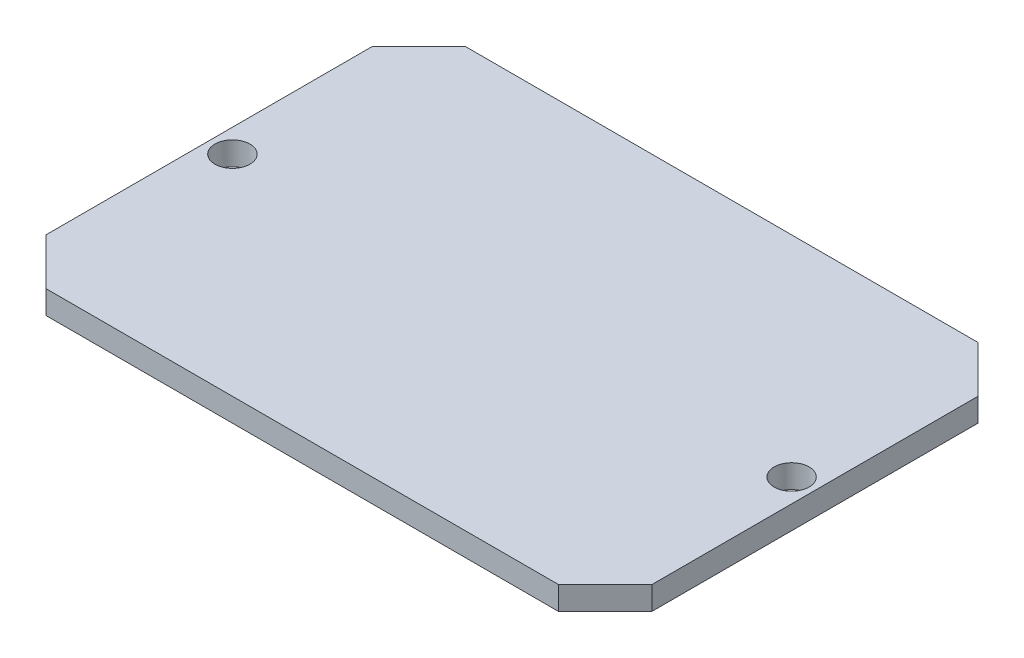
ISO-10303-21;
HEADER;
FILE_DESCRIPTION(('STEP AP214'),'2;1');
FILE_NAME('part.step','',(''),(''),'','','');
FILE_SCHEMA(('AUTOMOTIVE_DESIGN { 1 0 10303 214 1 1 1 1 }'));
ENDSEC;
DATA;
#1=APPLICATION_CONTEXT('core data for automotive mechanical design processes');
#2=APPLICATION_PROTOCOL_DEFINITION('international standard','automotive_design',2000,#1);
#3=PRODUCT_CONTEXT('',#1,'mechanical');
#4=PRODUCT('Part','Part','',(#3));
#5=PRODUCT_RELATED_PRODUCT_CATEGORY('part','',(#4));
#6=PRODUCT_DEFINITION_FORMATION('','',#4);
#7=PRODUCT_DEFINITION_CONTEXT('part definition',#1,'design');
#8=PRODUCT_DEFINITION('design','',#6,#7);
#9=PRODUCT_DEFINITION_SHAPE('','',#8);
#10=(LENGTH_UNIT() NAMED_UNIT(*) SI_UNIT(.MILLI.,.METRE.));
#11=(NAMED_UNIT(*) PLANE_ANGLE_UNIT() SI_UNIT($,.RADIAN.));
#12=(NAMED_UNIT(*) SI_UNIT($,.STERADIAN.) SOLID_ANGLE_UNIT());
#13=UNCERTAINTY_MEASURE_WITH_UNIT(LENGTH_MEASURE(1.E-05),#10,'distance_accuracy_value','');
#14=(GEOMETRIC_REPRESENTATION_CONTEXT(3) GLOBAL_UNCERTAINTY_ASSIGNED_CONTEXT((#13)) GLOBAL_UNIT_ASSIGNED_CONTEXT((#10,
#11,#12)) REPRESENTATION_CONTEXT('',''));
#15=CARTESIAN_POINT('',(0.,0.,0.));
#16=DIRECTION('',(0.,0.,1.));
#17=DIRECTION('',(1.,0.,0.));
#18=AXIS2_PLACEMENT_3D('',#15,#16,#17);
#19=CARTESIAN_POINT('',(31.75,3.175,-19.05));
#20=DIRECTION('',(0.,-1.,0.));
#21=DIRECTION('',(0.,0.,-1.));
#22=AXIS2_PLACEMENT_3D('',#19,#20,#21);
#23=PLANE('',#22);
#24=DIRECTION('',(1.,0.,0.));
#25=VECTOR('',#24,1.);
#26=CARTESIAN_POINT('',(-31.7499999999999,3.175,28.575));
#27=LINE('',#26,#25);
#28=CARTESIAN_POINT('',(-34.925,3.175,28.575));
#29=VERTEX_POINT('',#28);
#30=CARTESIAN_POINT('',(34.925,3.175,28.575));
#31=VERTEX_POINT('',#30);
#32=EDGE_CURVE('E171',#29,#31,#27,.T.);
#33=ORIENTED_EDGE('',*,*,#32,.T.);
#34=DIRECTION('',(-0.707106781186547,0.,0.707106781186548));
#35=VECTOR('',#34,1.);
#36=CARTESIAN_POINT('',(41.275,3.175,22.225));
#37=LINE('',#36,#35);
#38=CARTESIAN_POINT('',(41.275,3.175,22.225));
#39=VERTEX_POINT('',#38);
#40=EDGE_CURVE('E148',#31,#39,#37,.F.);
#41=ORIENTED_EDGE('',*,*,#40,.T.);
#42=DIRECTION('',(0.,0.,-1.));
#43=VECTOR('',#42,1.);
#44=CARTESIAN_POINT('',(41.275,3.175,-19.0499999999999));
#45=LINE('',#44,#43);
#46=CARTESIAN_POINT('',(41.275,3.175,-22.225));
#47=VERTEX_POINT('',#46);
#48=EDGE_CURVE('E119',#39,#47,#45,.T.);
#49=ORIENTED_EDGE('',*,*,#48,.T.);
#50=DIRECTION('',(0.707106781186546,0.,0.70710678118655));
#51=VECTOR('',#50,1.);
#52=CARTESIAN_POINT('',(34.925,3.175,-28.575));
#53=LINE('',#52,#51);
#54=CARTESIAN_POINT('',(34.925,3.175,-28.575));
#55=VERTEX_POINT('',#54);
#56=EDGE_CURVE('E143',#47,#55,#53,.F.);
#57=ORIENTED_EDGE('',*,*,#56,.T.);
#58=DIRECTION('',(-1.,0.,0.));
#59=VECTOR('',#58,1.);
#60=CARTESIAN_POINT('',(-31.7499999999999,3.175,-28.575));
#61=LINE('',#60,#59);
#62=CARTESIAN_POINT('',(-34.925,3.175,-28.575));
#63=VERTEX_POINT('',#62);
#64=EDGE_CURVE('E126',#55,#63,#61,.T.);
#65=ORIENTED_EDGE('',*,*,#64,.T.);
#66=DIRECTION('',(0.707106781186549,0.,-0.707106781186546));
#67=VECTOR('',#66,1.);
#68=CARTESIAN_POINT('',(-41.275,3.175,-22.225));
#69=LINE('',#68,#67);
#70=CARTESIAN_POINT('',(-41.275,3.175,-22.225));
#71=VERTEX_POINT('',#70);
#72=EDGE_CURVE('E55',#63,#71,#69,.F.);
#73=ORIENTED_EDGE('',*,*,#72,.T.);
#74=DIRECTION('',(0.,0.,1.));
#75=VECTOR('',#74,1.);
#76=CARTESIAN_POINT('',(-41.275,3.175,-19.0499999999999));
#77=LINE('',#76,#75);
#78=CARTESIAN_POINT('',(-41.275,3.175,22.225));
#79=VERTEX_POINT('',#78);
#80=EDGE_CURVE('E129',#71,#79,#77,.T.);
#81=ORIENTED_EDGE('',*,*,#80,.T.);
#82=DIRECTION('',(-0.707106781186546,0.,-0.707106781186549));
#83=VECTOR('',#82,1.);
#84=CARTESIAN_POINT('',(-34.925,3.175,28.575));
#85=LINE('',#84,#83);
#86=EDGE_CURVE('E146',#79,#29,#85,.F.);
#87=ORIENTED_EDGE('',*,*,#86,.T.);
#88=EDGE_LOOP('',(#33,#41,#49,#57,#65,#73,#81,#87));
#89=FACE_BOUND('',#88,.T.);
#90=CARTESIAN_POINT('',(38.1,3.175,0.));
#91=DIRECTION('',(0.,1.,0.));
#92=DIRECTION('',(0.,0.,1.));
#93=AXIS2_PLACEMENT_3D('',#90,#91,#92);
#94=CIRCLE('',#93,2.38252);
#95=CARTESIAN_POINT('',(38.1,3.175,2.38252));
#96=VERTEX_POINT('',#95);
#97=EDGE_CURVE('E164',#96,#96,#94,.T.);
#98=ORIENTED_EDGE('',*,*,#97,.F.);
#99=EDGE_LOOP('',(#98));
#100=FACE_BOUND('',#99,.T.);
#101=CARTESIAN_POINT('',(-38.1,3.175,0.));
#102=DIRECTION('',(0.,1.,0.));
#103=DIRECTION('',(0.,0.,-1.));
#104=AXIS2_PLACEMENT_3D('',#101,#102,#103);
#105=CIRCLE('',#104,2.38252000000001);
#106=CARTESIAN_POINT('',(-38.1,3.175,-2.38252000000001));
#107=VERTEX_POINT('',#106);
#108=EDGE_CURVE('E176',#107,#107,#105,.T.);
#109=ORIENTED_EDGE('',*,*,#108,.F.);
#110=EDGE_LOOP('',(#109));
#111=FACE_BOUND('',#110,.T.);
#112=ADVANCED_FACE('F33',(#89,#100,#111),#23,.F.);
#113=CARTESIAN_POINT('',(31.75,0.,-19.05));
#114=DIRECTION('',(0.,-1.,0.));
#115=DIRECTION('',(0.,0.,-1.));
#116=AXIS2_PLACEMENT_3D('',#113,#114,#115);
#117=PLANE('',#116);
#118=DIRECTION('',(0.,0.,-1.));
#119=VECTOR('',#118,1.);
#120=CARTESIAN_POINT('',(41.275,0.,-19.0499999999999));
#121=LINE('',#120,#119);
#122=CARTESIAN_POINT('',(41.275,0.,22.225));
#123=VERTEX_POINT('',#122);
#124=CARTESIAN_POINT('',(41.275,0.,-22.225));
#125=VERTEX_POINT('',#124);
#126=EDGE_CURVE('E116',#123,#125,#121,.T.);
#127=ORIENTED_EDGE('',*,*,#126,.F.);
#128=DIRECTION('',(0.707106781186547,0.,-0.707106781186548));
#129=VECTOR('',#128,1.);
#130=CARTESIAN_POINT('',(57.15,0.,6.34999999999999));
#131=LINE('',#130,#129);
#132=CARTESIAN_POINT('',(34.925,0.,28.575));
#133=VERTEX_POINT('',#132);
#134=EDGE_CURVE('E99',#123,#133,#131,.F.);
#135=ORIENTED_EDGE('',*,*,#134,.T.);
#136=DIRECTION('',(1.,0.,0.));
#137=VECTOR('',#136,1.);
#138=CARTESIAN_POINT('',(-31.7499999999999,0.,28.575));
#139=LINE('',#138,#137);
#140=CARTESIAN_POINT('',(-34.925,0.,28.575));
#141=VERTEX_POINT('',#140);
#142=EDGE_CURVE('E127',#141,#133,#139,.T.);
#143=ORIENTED_EDGE('',*,*,#142,.F.);
#144=DIRECTION('',(0.707106781186546,0.,0.707106781186549));
#145=VECTOR('',#144,1.);
#146=CARTESIAN_POINT('',(-25.4000000000002,0.,38.0999999999999));
#147=LINE('',#146,#145);
#148=CARTESIAN_POINT('',(-41.275,0.,22.225));
#149=VERTEX_POINT('',#148);
#150=EDGE_CURVE('E110',#141,#149,#147,.F.);
#151=ORIENTED_EDGE('',*,*,#150,.T.);
#152=DIRECTION('',(0.,0.,1.));
#153=VECTOR('',#152,1.);
#154=CARTESIAN_POINT('',(-41.275,0.,-19.0499999999999));
#155=LINE('',#154,#153);
#156=CARTESIAN_POINT('',(-41.275,0.,-22.225));
#157=VERTEX_POINT('',#156);
#158=EDGE_CURVE('E131',#157,#149,#155,.T.);
#159=ORIENTED_EDGE('',*,*,#158,.F.);
#160=DIRECTION('',(-0.707106781186549,0.,0.707106781186546));
#161=VECTOR('',#160,1.);
#162=CARTESIAN_POINT('',(-6.34999999999984,0.,-57.15));
#163=LINE('',#162,#161);
#164=CARTESIAN_POINT('',(-34.925,0.,-28.575));
#165=VERTEX_POINT('',#164);
#166=EDGE_CURVE('E137',#157,#165,#163,.F.);
#167=ORIENTED_EDGE('',*,*,#166,.T.);
#168=DIRECTION('',(-1.,0.,0.));
#169=VECTOR('',#168,1.);
#170=CARTESIAN_POINT('',(-31.7499999999999,0.,-28.575));
#171=LINE('',#170,#169);
#172=CARTESIAN_POINT('',(34.925,0.,-28.575));
#173=VERTEX_POINT('',#172);
#174=EDGE_CURVE('E159',#173,#165,#171,.T.);
#175=ORIENTED_EDGE('',*,*,#174,.F.);
#176=DIRECTION('',(-0.707106781186546,0.,-0.70710678118655));
#177=VECTOR('',#176,1.);
#178=CARTESIAN_POINT('',(38.1,0.,-25.4));
#179=LINE('',#178,#177);
#180=EDGE_CURVE('E120',#173,#125,#179,.F.);
#181=ORIENTED_EDGE('',*,*,#180,.T.);
#182=EDGE_LOOP('',(#127,#135,#143,#151,#159,#167,#175,#181));
#183=FACE_BOUND('',#182,.T.);
#184=CARTESIAN_POINT('',(38.1,0.,0.));
#185=DIRECTION('',(0.,1.,0.));
#186=DIRECTION('',(0.,0.,1.));
#187=AXIS2_PLACEMENT_3D('',#184,#185,#186);
#188=CIRCLE('',#187,2.38252);
#189=CARTESIAN_POINT('',(38.1,0.,2.38252));
#190=VERTEX_POINT('',#189);
#191=EDGE_CURVE('E167',#190,#190,#188,.T.);
#192=ORIENTED_EDGE('',*,*,#191,.T.);
#193=EDGE_LOOP('',(#192));
#194=FACE_BOUND('',#193,.T.);
#195=CARTESIAN_POINT('',(-38.1,0.,0.));
#196=DIRECTION('',(0.,1.,0.));
#197=DIRECTION('',(0.,0.,-1.));
#198=AXIS2_PLACEMENT_3D('',#195,#196,#197);
#199=CIRCLE('',#198,2.38252000000001);
#200=CARTESIAN_POINT('',(-38.1,0.,-2.38252000000001));
#201=VERTEX_POINT('',#200);
#202=EDGE_CURVE('E178',#201,#201,#199,.T.);
#203=ORIENTED_EDGE('',*,*,#202,.T.);
#204=EDGE_LOOP('',(#203));
#205=FACE_BOUND('',#204,.T.);
#206=ADVANCED_FACE('F123',(#183,#194,#205),#117,.T.);
#207=CARTESIAN_POINT('',(-31.7499999999999,3.175,-28.575));
#208=DIRECTION('',(0.,0.,1.));
#209=DIRECTION('',(1.,0.,0.));
#210=AXIS2_PLACEMENT_3D('',#207,#208,#209);
#211=PLANE('',#210);
#212=ORIENTED_EDGE('',*,*,#174,.T.);
#213=DIRECTION('',(0.,1.,0.));
#214=VECTOR('',#213,1.);
#215=CARTESIAN_POINT('',(-34.925,3.175,-28.575));
#216=LINE('',#215,#214);
#217=EDGE_CURVE('E11',#165,#63,#216,.T.);
#218=ORIENTED_EDGE('',*,*,#217,.T.);
#219=ORIENTED_EDGE('',*,*,#64,.F.);
#220=DIRECTION('',(0.,-1.,0.));
#221=VECTOR('',#220,1.);
#222=CARTESIAN_POINT('',(34.925,3.175,-28.575));
#223=LINE('',#222,#221);
#224=EDGE_CURVE('E41',#55,#173,#223,.T.);
#225=ORIENTED_EDGE('',*,*,#224,.T.);
#226=EDGE_LOOP('',(#212,#218,#219,#225));
#227=FACE_BOUND('',#226,.T.);
#228=ADVANCED_FACE('F158',(#227),#211,.F.);
#229=CARTESIAN_POINT('',(-41.275,3.175,-19.0499999999999));
#230=DIRECTION('',(1.,0.,0.));
#231=DIRECTION('',(0.,0.,-1.));
#232=AXIS2_PLACEMENT_3D('',#229,#230,#231);
#233=PLANE('',#232);
#234=ORIENTED_EDGE('',*,*,#158,.T.);
#235=DIRECTION('',(0.,1.,0.));
#236=VECTOR('',#235,1.);
#237=CARTESIAN_POINT('',(-41.275,3.175,22.225));
#238=LINE('',#237,#236);
#239=EDGE_CURVE('E48',#149,#79,#238,.T.);
#240=ORIENTED_EDGE('',*,*,#239,.T.);
#241=ORIENTED_EDGE('',*,*,#80,.F.);
#242=DIRECTION('',(0.,-1.,0.));
#243=VECTOR('',#242,1.);
#244=CARTESIAN_POINT('',(-41.275,3.175,-22.225));
#245=LINE('',#244,#243);
#246=EDGE_CURVE('E150',#71,#157,#245,.T.);
#247=ORIENTED_EDGE('',*,*,#246,.T.);
#248=EDGE_LOOP('',(#234,#240,#241,#247));
#249=FACE_BOUND('',#248,.T.);
#250=ADVANCED_FACE('F203',(#249),#233,.F.);
#251=CARTESIAN_POINT('',(-31.7499999999999,3.175,28.575));
#252=DIRECTION('',(0.,0.,-1.));
#253=DIRECTION('',(-1.,0.,0.));
#254=AXIS2_PLACEMENT_3D('',#251,#252,#253);
#255=PLANE('',#254);
#256=ORIENTED_EDGE('',*,*,#142,.T.);
#257=DIRECTION('',(0.,1.,0.));
#258=VECTOR('',#257,1.);
#259=CARTESIAN_POINT('',(34.925,3.175,28.575));
#260=LINE('',#259,#258);
#261=EDGE_CURVE('E104',#133,#31,#260,.T.);
#262=ORIENTED_EDGE('',*,*,#261,.T.);
#263=ORIENTED_EDGE('',*,*,#32,.F.);
#264=DIRECTION('',(0.,-1.,0.));
#265=VECTOR('',#264,1.);
#266=CARTESIAN_POINT('',(-34.925,3.175,28.575));
#267=LINE('',#266,#265);
#268=EDGE_CURVE('E109',#29,#141,#267,.T.);
#269=ORIENTED_EDGE('',*,*,#268,.T.);
#270=EDGE_LOOP('',(#256,#262,#263,#269));
#271=FACE_BOUND('',#270,.T.);
#272=ADVANCED_FACE('F200',(#271),#255,.F.);
#273=CARTESIAN_POINT('',(41.275,3.175,-19.0499999999999));
#274=DIRECTION('',(-1.,0.,0.));
#275=DIRECTION('',(0.,0.,1.));
#276=AXIS2_PLACEMENT_3D('',#273,#274,#275);
#277=PLANE('',#276);
#278=ORIENTED_EDGE('',*,*,#48,.F.);
#279=DIRECTION('',(0.,-1.,0.));
#280=VECTOR('',#279,1.);
#281=CARTESIAN_POINT('',(41.275,3.175,22.225));
#282=LINE('',#281,#280);
#283=EDGE_CURVE('E103',#39,#123,#282,.T.);
#284=ORIENTED_EDGE('',*,*,#283,.T.);
#285=ORIENTED_EDGE('',*,*,#126,.T.);
#286=DIRECTION('',(0.,1.,0.));
#287=VECTOR('',#286,1.);
#288=CARTESIAN_POINT('',(41.275,3.175,-22.225));
#289=LINE('',#288,#287);
#290=EDGE_CURVE('E121',#125,#47,#289,.T.);
#291=ORIENTED_EDGE('',*,*,#290,.T.);
#292=EDGE_LOOP('',(#278,#284,#285,#291));
#293=FACE_BOUND('',#292,.T.);
#294=ADVANCED_FACE('F115',(#293),#277,.F.);
#295=CARTESIAN_POINT('',(38.1,3.175,0.));
#296=DIRECTION('',(0.,-1.,0.));
#297=DIRECTION('',(0.,0.,-1.));
#298=AXIS2_PLACEMENT_3D('',#295,#296,#297);
#299=CYLINDRICAL_SURFACE('',#298,2.38252);
#300=ORIENTED_EDGE('',*,*,#97,.T.);
#301=EDGE_LOOP('',(#300));
#302=FACE_BOUND('',#301,.T.);
#303=ORIENTED_EDGE('',*,*,#191,.F.);
#304=EDGE_LOOP('',(#303));
#305=FACE_BOUND('',#304,.T.);
#306=ADVANCED_FACE('F195',(#302,#305),#299,.F.);
#307=CARTESIAN_POINT('',(-38.1,3.175,0.));
#308=DIRECTION('',(0.,-1.,0.));
#309=DIRECTION('',(0.,0.,-1.));
#310=AXIS2_PLACEMENT_3D('',#307,#308,#309);
#311=CYLINDRICAL_SURFACE('',#310,2.38252000000001);
#312=ORIENTED_EDGE('',*,*,#108,.T.);
#313=EDGE_LOOP('',(#312));
#314=FACE_BOUND('',#313,.T.);
#315=ORIENTED_EDGE('',*,*,#202,.F.);
#316=EDGE_LOOP('',(#315));
#317=FACE_BOUND('',#316,.T.);
#318=ADVANCED_FACE('F184',(#314,#317),#311,.F.);
#319=CARTESIAN_POINT('',(41.275,3.175,22.225));
#320=DIRECTION('',(-0.707106781186548,0.,-0.707106781186547));
#321=DIRECTION('',(-0.707106781186547,0.,0.707106781186548));
#322=AXIS2_PLACEMENT_3D('',#319,#320,#321);
#323=PLANE('',#322);
#324=ORIENTED_EDGE('',*,*,#40,.F.);
#325=ORIENTED_EDGE('',*,*,#261,.F.);
#326=ORIENTED_EDGE('',*,*,#134,.F.);
#327=ORIENTED_EDGE('',*,*,#283,.F.);
#328=EDGE_LOOP('',(#324,#325,#326,#327));
#329=FACE_BOUND('',#328,.T.);
#330=ADVANCED_FACE('F102',(#329),#323,.F.);
#331=CARTESIAN_POINT('',(-34.925,3.175,28.575));
#332=DIRECTION('',(0.707106781186549,0.,-0.707106781186546));
#333=DIRECTION('',(-0.707106781186546,0.,-0.707106781186549));
#334=AXIS2_PLACEMENT_3D('',#331,#332,#333);
#335=PLANE('',#334);
#336=ORIENTED_EDGE('',*,*,#86,.F.);
#337=ORIENTED_EDGE('',*,*,#239,.F.);
#338=ORIENTED_EDGE('',*,*,#150,.F.);
#339=ORIENTED_EDGE('',*,*,#268,.F.);
#340=EDGE_LOOP('',(#336,#337,#338,#339));
#341=FACE_BOUND('',#340,.T.);
#342=ADVANCED_FACE('F211',(#341),#335,.F.);
#343=CARTESIAN_POINT('',(-41.275,3.175,-22.225));
#344=DIRECTION('',(0.707106781186546,0.,0.707106781186549));
#345=DIRECTION('',(0.707106781186549,0.,-0.707106781186546));
#346=AXIS2_PLACEMENT_3D('',#343,#344,#345);
#347=PLANE('',#346);
#348=ORIENTED_EDGE('',*,*,#72,.F.);
#349=ORIENTED_EDGE('',*,*,#217,.F.);
#350=ORIENTED_EDGE('',*,*,#166,.F.);
#351=ORIENTED_EDGE('',*,*,#246,.F.);
#352=EDGE_LOOP('',(#348,#349,#350,#351));
#353=FACE_BOUND('',#352,.T.);
#354=ADVANCED_FACE('F213',(#353),#347,.F.);
#355=CARTESIAN_POINT('',(34.925,3.175,-28.575));
#356=DIRECTION('',(-0.70710678118655,0.,0.707106781186546));
#357=DIRECTION('',(0.707106781186546,0.,0.70710678118655));
#358=AXIS2_PLACEMENT_3D('',#355,#356,#357);
#359=PLANE('',#358);
#360=ORIENTED_EDGE('',*,*,#56,.F.);
#361=ORIENTED_EDGE('',*,*,#290,.F.);
#362=ORIENTED_EDGE('',*,*,#180,.F.);
#363=ORIENTED_EDGE('',*,*,#224,.F.);
#364=EDGE_LOOP('',(#360,#361,#362,#363));
#365=FACE_BOUND('',#364,.T.);
#366=ADVANCED_FACE('F35',(#365),#359,.F.);
#367=CLOSED_SHELL('',(#112,#206,#228,#250,#272,#294,#306,#318,#330,#342,#354,#366));
#368=MANIFOLD_SOLID_BREP('B2',#367);
#369=ADVANCED_BREP_SHAPE_REPRESENTATION('',(#18,#368),#14);
#370=SHAPE_DEFINITION_REPRESENTATION(#9,#369);
ENDSEC;
END-ISO-10303-21;
